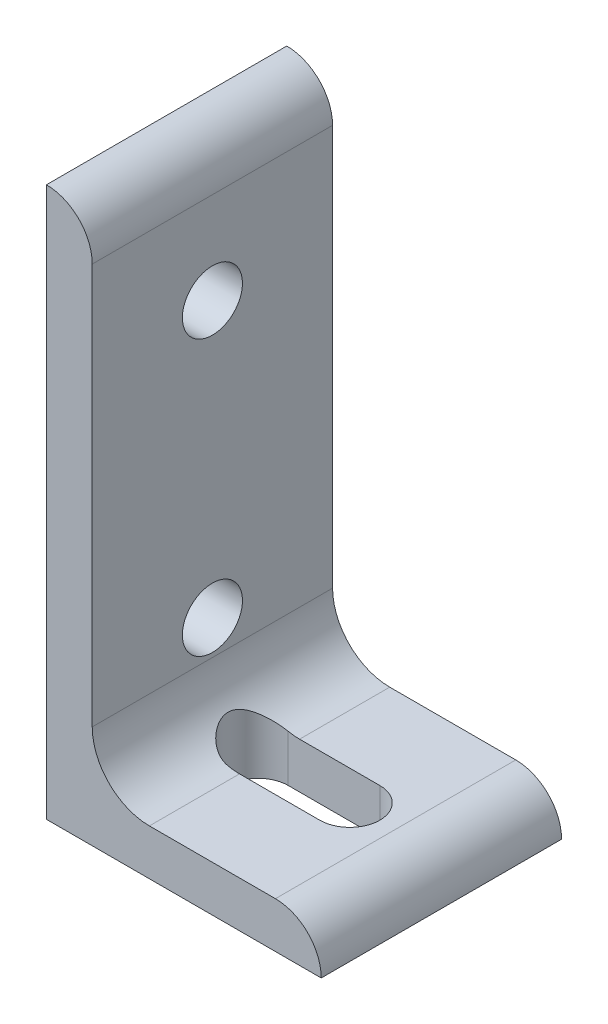
ISO-10303-21;
HEADER;
FILE_DESCRIPTION(('STEP AP214'),'2;1');
FILE_NAME('part.step','',(''),(''),'','','');
FILE_SCHEMA(('AUTOMOTIVE_DESIGN { 1 0 10303 214 1 1 1 1 }'));
ENDSEC;
DATA;
#1=APPLICATION_CONTEXT('core data for automotive mechanical design processes');
#2=APPLICATION_PROTOCOL_DEFINITION('international standard','automotive_design',2000,#1);
#3=PRODUCT_CONTEXT('',#1,'mechanical');
#4=PRODUCT('Part','Part','',(#3));
#5=PRODUCT_RELATED_PRODUCT_CATEGORY('part','',(#4));
#6=PRODUCT_DEFINITION_FORMATION('','',#4);
#7=PRODUCT_DEFINITION_CONTEXT('part definition',#1,'design');
#8=PRODUCT_DEFINITION('design','',#6,#7);
#9=PRODUCT_DEFINITION_SHAPE('','',#8);
#10=(LENGTH_UNIT() NAMED_UNIT(*) SI_UNIT(.MILLI.,.METRE.));
#11=(NAMED_UNIT(*) PLANE_ANGLE_UNIT() SI_UNIT($,.RADIAN.));
#12=(NAMED_UNIT(*) SI_UNIT($,.STERADIAN.) SOLID_ANGLE_UNIT());
#13=UNCERTAINTY_MEASURE_WITH_UNIT(LENGTH_MEASURE(1.E-05),#10,'distance_accuracy_value','');
#14=(GEOMETRIC_REPRESENTATION_CONTEXT(3) GLOBAL_UNCERTAINTY_ASSIGNED_CONTEXT((#13)) GLOBAL_UNIT_ASSIGNED_CONTEXT((#10,
#11,#12)) REPRESENTATION_CONTEXT('',''));
#15=CARTESIAN_POINT('',(0.,0.,0.));
#16=DIRECTION('',(0.,0.,1.));
#17=DIRECTION('',(1.,0.,0.));
#18=AXIS2_PLACEMENT_3D('',#15,#16,#17);
#19=CARTESIAN_POINT('',(38.1,0.,16.6624));
#20=DIRECTION('',(0.,1.,0.));
#21=DIRECTION('',(-1.,0.,0.));
#22=AXIS2_PLACEMENT_3D('',#19,#20,#21);
#23=PLANE('',#22);
#24=DIRECTION('',(-1.,0.,0.));
#25=VECTOR('',#24,1.);
#26=CARTESIAN_POINT('',(25.4,0.,4.1656));
#27=LINE('',#26,#25);
#28=CARTESIAN_POINT('',(25.4,0.,4.1656));
#29=VERTEX_POINT('',#28);
#30=CARTESIAN_POINT('',(12.7,0.,4.1656));
#31=VERTEX_POINT('',#30);
#32=EDGE_CURVE('E249',#29,#31,#27,.T.);
#33=ORIENTED_EDGE('',*,*,#32,.F.);
#34=CARTESIAN_POINT('',(25.4,0.,0.));
#35=DIRECTION('',(0.,-1.,0.));
#36=DIRECTION('',(1.,0.,0.));
#37=AXIS2_PLACEMENT_3D('',#34,#35,#36);
#38=CIRCLE('',#37,4.1656);
#39=CARTESIAN_POINT('',(25.4,0.,-4.1656));
#40=VERTEX_POINT('',#39);
#41=EDGE_CURVE('E54',#40,#29,#38,.T.);
#42=ORIENTED_EDGE('',*,*,#41,.F.);
#43=DIRECTION('',(1.,0.,0.));
#44=VECTOR('',#43,1.);
#45=CARTESIAN_POINT('',(12.7,0.,-4.1656));
#46=LINE('',#45,#44);
#47=CARTESIAN_POINT('',(12.7,0.,-4.1656));
#48=VERTEX_POINT('',#47);
#49=EDGE_CURVE('E239',#48,#40,#46,.T.);
#50=ORIENTED_EDGE('',*,*,#49,.F.);
#51=CARTESIAN_POINT('',(12.7,0.,0.));
#52=DIRECTION('',(0.,-1.,0.));
#53=DIRECTION('',(1.,0.,0.));
#54=AXIS2_PLACEMENT_3D('',#51,#52,#53);
#55=CIRCLE('',#54,4.1656);
#56=EDGE_CURVE('E246',#31,#48,#55,.T.);
#57=ORIENTED_EDGE('',*,*,#56,.F.);
#58=EDGE_LOOP('',(#33,#42,#50,#57));
#59=FACE_BOUND('',#58,.T.);
#60=DIRECTION('',(1.,0.,0.));
#61=VECTOR('',#60,1.);
#62=CARTESIAN_POINT('',(38.1,0.,-16.6624));
#63=LINE('',#62,#61);
#64=CARTESIAN_POINT('',(0.,0.,-16.6624));
#65=VERTEX_POINT('',#64);
#66=CARTESIAN_POINT('',(38.1,0.,-16.6624));
#67=VERTEX_POINT('',#66);
#68=EDGE_CURVE('E188',#65,#67,#63,.T.);
#69=ORIENTED_EDGE('',*,*,#68,.T.);
#70=DIRECTION('',(0.,0.,-1.));
#71=VECTOR('',#70,1.);
#72=CARTESIAN_POINT('',(38.1,0.,16.6624));
#73=LINE('',#72,#71);
#74=CARTESIAN_POINT('',(38.1,0.,16.6624));
#75=VERTEX_POINT('',#74);
#76=EDGE_CURVE('E153',#75,#67,#73,.T.);
#77=ORIENTED_EDGE('',*,*,#76,.F.);
#78=DIRECTION('',(1.,0.,0.));
#79=VECTOR('',#78,1.);
#80=CARTESIAN_POINT('',(38.1,0.,16.6624));
#81=LINE('',#80,#79);
#82=CARTESIAN_POINT('',(0.,0.,16.6624));
#83=VERTEX_POINT('',#82);
#84=EDGE_CURVE('E175',#83,#75,#81,.T.);
#85=ORIENTED_EDGE('',*,*,#84,.F.);
#86=DIRECTION('',(0.,0.,-1.));
#87=VECTOR('',#86,1.);
#88=CARTESIAN_POINT('',(0.,0.,16.6624));
#89=LINE('',#88,#87);
#90=EDGE_CURVE('E194',#83,#65,#89,.T.);
#91=ORIENTED_EDGE('',*,*,#90,.T.);
#92=EDGE_LOOP('',(#69,#77,#85,#91));
#93=FACE_BOUND('',#92,.T.);
#94=ADVANCED_FACE('F39',(#59,#93),#23,.F.);
#95=CARTESIAN_POINT('',(14.2748,6.35,16.6624));
#96=DIRECTION('',(0.,-1.,0.));
#97=DIRECTION('',(1.,0.,0.));
#98=AXIS2_PLACEMENT_3D('',#95,#96,#97);
#99=PLANE('',#98);
#100=DIRECTION('',(0.,0.,-1.));
#101=VECTOR('',#100,1.);
#102=CARTESIAN_POINT('',(14.2748,6.35,16.6624));
#103=LINE('',#102,#101);
#104=CARTESIAN_POINT('',(14.2748,6.35,-4.1656));
#105=VERTEX_POINT('',#104);
#106=CARTESIAN_POINT('',(14.2748,6.35,-16.6624));
#107=VERTEX_POINT('',#106);
#108=EDGE_CURVE('E154',#105,#107,#103,.T.);
#109=ORIENTED_EDGE('',*,*,#108,.F.);
#110=DIRECTION('',(-1.,0.,0.));
#111=VECTOR('',#110,1.);
#112=CARTESIAN_POINT('',(12.7,6.34999999999999,-4.1656));
#113=LINE('',#112,#111);
#114=CARTESIAN_POINT('',(25.4,6.34999999999999,-4.1656));
#115=VERTEX_POINT('',#114);
#116=EDGE_CURVE('E252',#115,#105,#113,.T.);
#117=ORIENTED_EDGE('',*,*,#116,.F.);
#118=CARTESIAN_POINT('',(25.4,6.34999999999999,0.));
#119=DIRECTION('',(0.,-1.,0.));
#120=DIRECTION('',(1.,0.,0.));
#121=AXIS2_PLACEMENT_3D('',#118,#119,#120);
#122=CIRCLE('',#121,4.1656);
#123=CARTESIAN_POINT('',(25.4,6.34999999999999,4.1656));
#124=VERTEX_POINT('',#123);
#125=EDGE_CURVE('E147',#124,#115,#122,.F.);
#126=ORIENTED_EDGE('',*,*,#125,.F.);
#127=DIRECTION('',(1.,0.,0.));
#128=VECTOR('',#127,1.);
#129=CARTESIAN_POINT('',(25.4,6.34999999999999,4.1656));
#130=LINE('',#129,#128);
#131=CARTESIAN_POINT('',(14.2748,6.35,4.1656));
#132=VERTEX_POINT('',#131);
#133=EDGE_CURVE('E130',#132,#124,#130,.T.);
#134=ORIENTED_EDGE('',*,*,#133,.F.);
#135=CARTESIAN_POINT('',(14.2748,6.35,16.6624));
#136=VERTEX_POINT('',#135);
#137=EDGE_CURVE('E143',#136,#132,#103,.T.);
#138=ORIENTED_EDGE('',*,*,#137,.F.);
#139=DIRECTION('',(-1.,0.,0.));
#140=VECTOR('',#139,1.);
#141=CARTESIAN_POINT('',(14.2748,6.35,16.6624));
#142=LINE('',#141,#140);
#143=CARTESIAN_POINT('',(31.75,6.35,16.6624));
#144=VERTEX_POINT('',#143);
#145=EDGE_CURVE('E173',#144,#136,#142,.T.);
#146=ORIENTED_EDGE('',*,*,#145,.F.);
#147=DIRECTION('',(0.,0.,-1.));
#148=VECTOR('',#147,1.);
#149=CARTESIAN_POINT('',(31.75,6.35,16.6624));
#150=LINE('',#149,#148);
#151=CARTESIAN_POINT('',(31.75,6.35,-16.6624));
#152=VERTEX_POINT('',#151);
#153=EDGE_CURVE('E157',#144,#152,#150,.T.);
#154=ORIENTED_EDGE('',*,*,#153,.T.);
#155=DIRECTION('',(-1.,0.,0.));
#156=VECTOR('',#155,1.);
#157=CARTESIAN_POINT('',(14.2748,6.35,-16.6624));
#158=LINE('',#157,#156);
#159=EDGE_CURVE('E190',#152,#107,#158,.T.);
#160=ORIENTED_EDGE('',*,*,#159,.T.);
#161=EDGE_LOOP('',(#109,#117,#126,#134,#138,#146,#154,#160));
#162=FACE_BOUND('',#161,.T.);
#163=ADVANCED_FACE('F141',(#162),#99,.F.);
#164=CARTESIAN_POINT('',(14.2748,14.2748,16.6624));
#165=DIRECTION('',(0.,0.,-1.));
#166=DIRECTION('',(-1.,0.,0.));
#167=AXIS2_PLACEMENT_3D('',#164,#165,#166);
#168=CYLINDRICAL_SURFACE('',#167,7.9248);
#169=CARTESIAN_POINT('',(12.7,6.5080464954783,-4.1656));
#170=CARTESIAN_POINT('',(12.5835580765924,6.5316322027445,-4.16561740535238));
#171=CARTESIAN_POINT('',(12.4676933434238,6.55787464961568,-4.16071876942945));
#172=CARTESIAN_POINT('',(12.2380828578918,6.61528756573018,-4.14150664543221));
#173=CARTESIAN_POINT('',(12.1243353857246,6.64645382103028,-4.12720117520229));
#174=CARTESIAN_POINT('',(11.9004629020729,6.71314980276589,-4.08971516347229));
#175=CARTESIAN_POINT('',(11.7903189589891,6.7486494217396,-4.06659372747525));
#176=CARTESIAN_POINT('',(11.5735592761762,6.82369749415313,-4.0119644114413));
#177=CARTESIAN_POINT('',(11.4669442126567,6.86324671770908,-3.98045493441524));
#178=CARTESIAN_POINT('',(11.1539873654591,6.98693094869243,-3.87432865818805));
#179=CARTESIAN_POINT('',(10.9536021930045,7.07638533753304,-3.78795143881343));
#180=CARTESIAN_POINT('',(10.5719346004298,7.2650354324518,-3.58750983105807));
#181=CARTESIAN_POINT('',(10.3906923921382,7.36425083064593,-3.47338876021333));
#182=CARTESIAN_POINT('',(10.0283860031617,7.58001868893749,-3.2049341898041));
#183=CARTESIAN_POINT('',(9.85008010781651,7.69720346524857,-3.04738262722771));
#184=CARTESIAN_POINT('',(9.52219145004701,7.93007233129113,-2.70373754837415));
#185=CARTESIAN_POINT('',(9.37261112788441,8.04575629274941,-2.5176416096414));
#186=CARTESIAN_POINT('',(9.12625896600255,8.24850232099304,-2.14977251920147));
#187=CARTESIAN_POINT('',(9.02487422812993,8.33719389505684,-1.97199492815169));
#188=CARTESIAN_POINT('',(8.84742149049865,8.49895258090931,-1.59767764113758));
#189=CARTESIAN_POINT('',(8.77130630738445,8.57204872023772,-1.40117380436337));
#190=CARTESIAN_POINT('',(8.66225688177177,8.67959197113029,-1.03748745676759));
#191=CARTESIAN_POINT('',(8.62347457603908,8.71902533273093,-0.873562635560928));
#192=CARTESIAN_POINT('',(8.56591907001295,8.77817530674138,-0.538824344087064));
#193=CARTESIAN_POINT('',(8.54711852353128,8.79791886349327,-0.368020621337599));
#194=CARTESIAN_POINT('',(8.53088867576541,8.81493669321512,-0.023552506824803));
#195=CARTESIAN_POINT('',(8.53354358502665,8.81212242931868,0.150120484464318));
#196=CARTESIAN_POINT('',(8.56019683034547,8.78425424330876,0.49404196625376));
#197=CARTESIAN_POINT('',(8.58421373123496,8.75918097684412,0.664287346324099));
#198=CARTESIAN_POINT('',(8.65780369031964,8.68418406210569,1.02601276038823));
#199=CARTESIAN_POINT('',(8.71112980332612,8.63066424196057,1.21595856593888));
#200=CARTESIAN_POINT('',(8.84129823674257,8.5052584919694,1.5812737039262));
#201=CARTESIAN_POINT('',(8.91818873177568,8.43333498813349,1.75661223077297));
#202=CARTESIAN_POINT('',(9.06363018103847,8.30384494130255,2.0359272444735));
#203=CARTESIAN_POINT('',(9.12656845322995,8.24936632169106,2.14436787754785));
#204=CARTESIAN_POINT('',(9.26101430957051,8.13704224540913,2.35395380195965));
#205=CARTESIAN_POINT('',(9.33252175927477,8.07919684156867,2.45509920771459));
#206=CARTESIAN_POINT('',(9.4837155209309,7.96154748114299,2.65009049694284));
#207=CARTESIAN_POINT('',(9.56341244113339,7.90174105435643,2.74392662870047));
#208=CARTESIAN_POINT('',(9.73054656283487,7.78151020507392,2.92397922756217));
#209=CARTESIAN_POINT('',(9.8179830625586,7.72108583904725,3.0101963840921));
#210=CARTESIAN_POINT('',(10.0018115278443,7.59974547611754,3.17609532271024));
#211=CARTESIAN_POINT('',(10.0983271819743,7.53883775067407,3.25564621844663));
#212=CARTESIAN_POINT('',(10.2987564408494,7.4186212524069,3.4061644336177));
#213=CARTESIAN_POINT('',(10.4026693181952,7.35931232315556,3.47713259518089));
#214=CARTESIAN_POINT('',(10.6172568575748,7.24346608950344,3.60974590493582));
#215=CARTESIAN_POINT('',(10.7279114076557,7.18692136875626,3.67141704343744));
#216=CARTESIAN_POINT('',(10.9558134721983,7.07738622979663,3.78500251768188));
#217=CARTESIAN_POINT('',(11.0730609443779,7.02439578879452,3.8369169159877));
#218=CARTESIAN_POINT('',(11.3093524254135,6.92466825089226,3.92858917841972));
#219=CARTESIAN_POINT('',(11.4281909862074,6.87777747044407,3.96870802231849));
#220=CARTESIAN_POINT('',(11.6706923096469,6.78896300700549,4.03839853103678));
#221=CARTESIAN_POINT('',(11.7943535508775,6.74703777411184,4.06797349275737));
#222=CARTESIAN_POINT('',(12.0467219375613,6.66850733292112,4.11607493407712));
#223=CARTESIAN_POINT('',(12.1754640074441,6.63195239223434,4.13450150587616));
#224=CARTESIAN_POINT('',(12.4358810439194,6.56512440811821,4.15928635187595));
#225=CARTESIAN_POINT('',(12.567559607526,6.5348595974061,4.16562889765032));
#226=CARTESIAN_POINT('',(12.7,6.5080464954783,4.1656));
#227=B_SPLINE_CURVE_WITH_KNOTS('',3,(#169,#170,#171,#172,#173,#174,#175,#176,#177,#178,#179,
#180,#181,#182,#183,#184,#185,#186,#187,#188,#189,#190,#191,#192,#193,#194,#195,#196,#197,#198,
#199,#200,#201,#202,#203,#204,#205,#206,#207,#208,#209,#210,#211,#212,#213,#214,#215,#216,#217,
#218,#219,#220,#221,#222,#223,#224,#225,#226),.UNSPECIFIED.,.F.,.F.,(4,2,2,2,2,2,2,2,2,2,2,2,2,
2,2,2,2,2,2,2,2,2,2,2,2,2,2,2,4),(0.,0.356230564600408,0.712157891644706,1.0657397548369,
1.41938898426377,2.12376165412194,2.82958567821204,3.62213731146315,4.41475624289145,
5.08166429224455,5.74731999275771,6.26425629437071,6.7804842243145,7.29873927905102,
7.81744516857058,8.42741656536718,9.0386433912707,9.44829000204645,9.85793018657467,
10.2681078534863,10.6782483661516,11.0951378285751,11.5119863530162,11.9276470386122,
12.3433050587821,12.7444590989697,13.145487594549,13.5500586889426,13.955156009535),.UNSPECIFIED.);
#228=CARTESIAN_POINT('',(12.7,6.5080464954783,-4.1656));
#229=VERTEX_POINT('',#228);
#230=CARTESIAN_POINT('',(12.7,6.5080464954783,4.1656));
#231=VERTEX_POINT('',#230);
#232=EDGE_CURVE('E62',#229,#231,#227,.T.);
#233=ORIENTED_EDGE('',*,*,#232,.F.);
#234=CARTESIAN_POINT('',(14.2748,14.2748,-4.1656));
#235=DIRECTION('',(0.,0.,-1.));
#236=DIRECTION('',(-1.,0.,0.));
#237=AXIS2_PLACEMENT_3D('',#234,#235,#236);
#238=CIRCLE('',#237,7.9248);
#239=EDGE_CURVE('E255',#105,#229,#238,.T.);
#240=ORIENTED_EDGE('',*,*,#239,.F.);
#241=ORIENTED_EDGE('',*,*,#108,.T.);
#242=CARTESIAN_POINT('',(14.2748,14.2748,-16.6624));
#243=DIRECTION('',(0.,0.,-1.));
#244=DIRECTION('',(1.,0.,0.));
#245=AXIS2_PLACEMENT_3D('',#242,#243,#244);
#246=CIRCLE('',#245,7.9248);
#247=CARTESIAN_POINT('',(6.34999999999999,14.2748,-16.6624));
#248=VERTEX_POINT('',#247);
#249=EDGE_CURVE('E197',#107,#248,#246,.T.);
#250=ORIENTED_EDGE('',*,*,#249,.T.);
#251=DIRECTION('',(0.,0.,-1.));
#252=VECTOR('',#251,1.);
#253=CARTESIAN_POINT('',(6.34999999999999,14.2748,16.6624));
#254=LINE('',#253,#252);
#255=CARTESIAN_POINT('',(6.34999999999999,14.2748,16.6624));
#256=VERTEX_POINT('',#255);
#257=EDGE_CURVE('E159',#256,#248,#254,.T.);
#258=ORIENTED_EDGE('',*,*,#257,.F.);
#259=CARTESIAN_POINT('',(14.2748,14.2748,16.6624));
#260=DIRECTION('',(0.,0.,-1.));
#261=DIRECTION('',(1.,0.,0.));
#262=AXIS2_PLACEMENT_3D('',#259,#260,#261);
#263=CIRCLE('',#262,7.9248);
#264=EDGE_CURVE('E152',#136,#256,#263,.T.);
#265=ORIENTED_EDGE('',*,*,#264,.F.);
#266=ORIENTED_EDGE('',*,*,#137,.T.);
#267=CARTESIAN_POINT('',(14.2748,14.2748,4.1656));
#268=DIRECTION('',(0.,0.,1.));
#269=DIRECTION('',(1.,0.,0.));
#270=AXIS2_PLACEMENT_3D('',#267,#268,#269);
#271=CIRCLE('',#270,7.9248);
#272=EDGE_CURVE('E127',#231,#132,#271,.T.);
#273=ORIENTED_EDGE('',*,*,#272,.F.);
#274=EDGE_LOOP('',(#233,#240,#241,#250,#258,#265,#266,#273));
#275=FACE_BOUND('',#274,.T.);
#276=ADVANCED_FACE('F150',(#275),#168,.F.);
#277=CARTESIAN_POINT('',(6.34999999999999,76.2,16.6624));
#278=DIRECTION('',(-1.,0.,0.));
#279=DIRECTION('',(0.,-1.,0.));
#280=AXIS2_PLACEMENT_3D('',#277,#278,#279);
#281=PLANE('',#280);
#282=CARTESIAN_POINT('',(6.34999999999999,19.05,0.));
#283=DIRECTION('',(-1.,0.,0.));
#284=DIRECTION('',(0.,-1.,0.));
#285=AXIS2_PLACEMENT_3D('',#282,#283,#284);
#286=CIRCLE('',#285,4.1656);
#287=CARTESIAN_POINT('',(6.34999999999999,14.8844,0.));
#288=VERTEX_POINT('',#287);
#289=EDGE_CURVE('E232',#288,#288,#286,.F.);
#290=ORIENTED_EDGE('',*,*,#289,.F.);
#291=EDGE_LOOP('',(#290));
#292=FACE_BOUND('',#291,.T.);
#293=CARTESIAN_POINT('',(6.34999999999999,57.15,0.));
#294=DIRECTION('',(-1.,0.,0.));
#295=DIRECTION('',(0.,-1.,0.));
#296=AXIS2_PLACEMENT_3D('',#293,#294,#295);
#297=CIRCLE('',#296,4.1656);
#298=CARTESIAN_POINT('',(6.34999999999999,52.9844,0.));
#299=VERTEX_POINT('',#298);
#300=EDGE_CURVE('E195',#299,#299,#297,.F.);
#301=ORIENTED_EDGE('',*,*,#300,.F.);
#302=EDGE_LOOP('',(#301));
#303=FACE_BOUND('',#302,.T.);
#304=DIRECTION('',(0.,1.,0.));
#305=VECTOR('',#304,1.);
#306=CARTESIAN_POINT('',(6.34999999999999,76.2,-16.6624));
#307=LINE('',#306,#305);
#308=CARTESIAN_POINT('',(6.34999999999999,69.85,-16.6624));
#309=VERTEX_POINT('',#308);
#310=EDGE_CURVE('E207',#248,#309,#307,.T.);
#311=ORIENTED_EDGE('',*,*,#310,.T.);
#312=DIRECTION('',(0.,0.,-1.));
#313=VECTOR('',#312,1.);
#314=CARTESIAN_POINT('',(6.34999999999999,69.85,16.6624));
#315=LINE('',#314,#313);
#316=CARTESIAN_POINT('',(6.34999999999999,69.85,16.6624));
#317=VERTEX_POINT('',#316);
#318=EDGE_CURVE('E11',#309,#317,#315,.F.);
#319=ORIENTED_EDGE('',*,*,#318,.T.);
#320=DIRECTION('',(0.,1.,0.));
#321=VECTOR('',#320,1.);
#322=CARTESIAN_POINT('',(6.34999999999999,76.2,16.6624));
#323=LINE('',#322,#321);
#324=EDGE_CURVE('E224',#256,#317,#323,.T.);
#325=ORIENTED_EDGE('',*,*,#324,.F.);
#326=ORIENTED_EDGE('',*,*,#257,.T.);
#327=EDGE_LOOP('',(#311,#319,#325,#326));
#328=FACE_BOUND('',#327,.T.);
#329=ADVANCED_FACE('F221',(#292,#303,#328),#281,.F.);
#330=CARTESIAN_POINT('',(0.,0.,16.6624));
#331=DIRECTION('',(1.,0.,0.));
#332=DIRECTION('',(0.,1.,0.));
#333=AXIS2_PLACEMENT_3D('',#330,#331,#332);
#334=PLANE('',#333);
#335=CARTESIAN_POINT('',(0.,19.05,0.));
#336=DIRECTION('',(-1.,0.,0.));
#337=DIRECTION('',(0.,-1.,0.));
#338=AXIS2_PLACEMENT_3D('',#335,#336,#337);
#339=CIRCLE('',#338,4.1656);
#340=CARTESIAN_POINT('',(0.,14.8844,0.));
#341=VERTEX_POINT('',#340);
#342=EDGE_CURVE('E148',#341,#341,#339,.T.);
#343=ORIENTED_EDGE('',*,*,#342,.F.);
#344=EDGE_LOOP('',(#343));
#345=FACE_BOUND('',#344,.T.);
#346=CARTESIAN_POINT('',(0.,57.15,0.));
#347=DIRECTION('',(-1.,0.,0.));
#348=DIRECTION('',(0.,-1.,0.));
#349=AXIS2_PLACEMENT_3D('',#346,#347,#348);
#350=CIRCLE('',#349,4.1656);
#351=CARTESIAN_POINT('',(0.,52.9844,0.));
#352=VERTEX_POINT('',#351);
#353=EDGE_CURVE('E200',#352,#352,#350,.T.);
#354=ORIENTED_EDGE('',*,*,#353,.F.);
#355=EDGE_LOOP('',(#354));
#356=FACE_BOUND('',#355,.T.);
#357=DIRECTION('',(0.,-1.,0.));
#358=VECTOR('',#357,1.);
#359=CARTESIAN_POINT('',(0.,0.,-16.6624));
#360=LINE('',#359,#358);
#361=CARTESIAN_POINT('',(0.,76.2,-16.6624));
#362=VERTEX_POINT('',#361);
#363=EDGE_CURVE('E210',#362,#65,#360,.T.);
#364=ORIENTED_EDGE('',*,*,#363,.T.);
#365=ORIENTED_EDGE('',*,*,#90,.F.);
#366=DIRECTION('',(0.,-1.,0.));
#367=VECTOR('',#366,1.);
#368=CARTESIAN_POINT('',(0.,0.,16.6624));
#369=LINE('',#368,#367);
#370=CARTESIAN_POINT('',(0.,76.2,16.6624));
#371=VERTEX_POINT('',#370);
#372=EDGE_CURVE('E203',#371,#83,#369,.T.);
#373=ORIENTED_EDGE('',*,*,#372,.F.);
#374=DIRECTION('',(0.,0.,-1.));
#375=VECTOR('',#374,1.);
#376=CARTESIAN_POINT('',(0.,76.2,16.6624));
#377=LINE('',#376,#375);
#378=EDGE_CURVE('E212',#371,#362,#377,.T.);
#379=ORIENTED_EDGE('',*,*,#378,.T.);
#380=EDGE_LOOP('',(#364,#365,#373,#379));
#381=FACE_BOUND('',#380,.T.);
#382=ADVANCED_FACE('F299',(#345,#356,#381),#334,.F.);
#383=CARTESIAN_POINT('',(14.2748,14.2748,16.6624));
#384=DIRECTION('',(0.,0.,1.));
#385=DIRECTION('',(1.,0.,0.));
#386=AXIS2_PLACEMENT_3D('',#383,#384,#385);
#387=PLANE('',#386);
#388=ORIENTED_EDGE('',*,*,#84,.T.);
#389=CARTESIAN_POINT('',(31.75,0.,16.6624));
#390=DIRECTION('',(0.,0.,1.));
#391=DIRECTION('',(1.,0.,0.));
#392=AXIS2_PLACEMENT_3D('',#389,#390,#391);
#393=CIRCLE('',#392,6.35);
#394=EDGE_CURVE('E47',#75,#144,#393,.T.);
#395=ORIENTED_EDGE('',*,*,#394,.T.);
#396=ORIENTED_EDGE('',*,*,#145,.T.);
#397=ORIENTED_EDGE('',*,*,#264,.T.);
#398=ORIENTED_EDGE('',*,*,#324,.T.);
#399=CARTESIAN_POINT('',(0.,69.85,16.6624));
#400=DIRECTION('',(0.,0.,1.));
#401=DIRECTION('',(1.,0.,0.));
#402=AXIS2_PLACEMENT_3D('',#399,#400,#401);
#403=CIRCLE('',#402,6.35);
#404=EDGE_CURVE('E169',#317,#371,#403,.T.);
#405=ORIENTED_EDGE('',*,*,#404,.T.);
#406=ORIENTED_EDGE('',*,*,#372,.T.);
#407=EDGE_LOOP('',(#388,#395,#396,#397,#398,#405,#406));
#408=FACE_BOUND('',#407,.T.);
#409=ADVANCED_FACE('F172',(#408),#387,.T.);
#410=CARTESIAN_POINT('',(14.2748,14.2748,-16.6624));
#411=DIRECTION('',(0.,0.,1.));
#412=DIRECTION('',(1.,0.,0.));
#413=AXIS2_PLACEMENT_3D('',#410,#411,#412);
#414=PLANE('',#413);
#415=ORIENTED_EDGE('',*,*,#159,.F.);
#416=CARTESIAN_POINT('',(31.75,0.,-16.6624));
#417=DIRECTION('',(0.,0.,1.));
#418=DIRECTION('',(1.,0.,0.));
#419=AXIS2_PLACEMENT_3D('',#416,#417,#418);
#420=CIRCLE('',#419,6.35);
#421=EDGE_CURVE('E167',#152,#67,#420,.F.);
#422=ORIENTED_EDGE('',*,*,#421,.T.);
#423=ORIENTED_EDGE('',*,*,#68,.F.);
#424=ORIENTED_EDGE('',*,*,#363,.F.);
#425=CARTESIAN_POINT('',(0.,69.85,-16.6624));
#426=DIRECTION('',(0.,0.,1.));
#427=DIRECTION('',(1.,0.,0.));
#428=AXIS2_PLACEMENT_3D('',#425,#426,#427);
#429=CIRCLE('',#428,6.35);
#430=EDGE_CURVE('E165',#362,#309,#429,.F.);
#431=ORIENTED_EDGE('',*,*,#430,.T.);
#432=ORIENTED_EDGE('',*,*,#310,.F.);
#433=ORIENTED_EDGE('',*,*,#249,.F.);
#434=EDGE_LOOP('',(#415,#422,#423,#424,#431,#432,#433));
#435=FACE_BOUND('',#434,.T.);
#436=ADVANCED_FACE('F186',(#435),#414,.F.);
#437=CARTESIAN_POINT('',(31.75,0.,16.6624));
#438=DIRECTION('',(0.,0.,-1.));
#439=DIRECTION('',(-1.,0.,0.));
#440=AXIS2_PLACEMENT_3D('',#437,#438,#439);
#441=CYLINDRICAL_SURFACE('',#440,6.35);
#442=ORIENTED_EDGE('',*,*,#394,.F.);
#443=ORIENTED_EDGE('',*,*,#76,.T.);
#444=ORIENTED_EDGE('',*,*,#421,.F.);
#445=ORIENTED_EDGE('',*,*,#153,.F.);
#446=EDGE_LOOP('',(#442,#443,#444,#445));
#447=FACE_BOUND('',#446,.T.);
#448=ADVANCED_FACE('F182',(#447),#441,.T.);
#449=CARTESIAN_POINT('',(0.,69.85,16.6624));
#450=DIRECTION('',(0.,0.,-1.));
#451=DIRECTION('',(-1.,0.,0.));
#452=AXIS2_PLACEMENT_3D('',#449,#450,#451);
#453=CYLINDRICAL_SURFACE('',#452,6.35);
#454=ORIENTED_EDGE('',*,*,#404,.F.);
#455=ORIENTED_EDGE('',*,*,#318,.F.);
#456=ORIENTED_EDGE('',*,*,#430,.F.);
#457=ORIENTED_EDGE('',*,*,#378,.F.);
#458=EDGE_LOOP('',(#454,#455,#456,#457));
#459=FACE_BOUND('',#458,.T.);
#460=ADVANCED_FACE('F41',(#459),#453,.T.);
#461=CARTESIAN_POINT('',(38.101,57.15,0.));
#462=DIRECTION('',(-1.,0.,0.));
#463=DIRECTION('',(0.,-1.,0.));
#464=AXIS2_PLACEMENT_3D('',#461,#462,#463);
#465=CYLINDRICAL_SURFACE('',#464,4.1656);
#466=CARTESIAN_POINT('',(0.,52.9844,0.));
#467=CARTESIAN_POINT('',(0.0661458333333272,52.9844,0.));
#468=CARTESIAN_POINT('',(0.132291666666661,52.9844,0.));
#469=CARTESIAN_POINT('',(0.264583333333327,52.9844,0.));
#470=CARTESIAN_POINT('',(0.330729166666659,52.9844,0.));
#471=CARTESIAN_POINT('',(0.463020833333325,52.9844,0.));
#472=CARTESIAN_POINT('',(0.529166666666659,52.9844,0.));
#473=CARTESIAN_POINT('',(0.661458333333325,52.9844,0.));
#474=CARTESIAN_POINT('',(0.727604166666657,52.9844,0.));
#475=CARTESIAN_POINT('',(0.859895833333323,52.9844,0.));
#476=CARTESIAN_POINT('',(0.926041666666657,52.9844,0.));
#477=CARTESIAN_POINT('',(1.05833333333333,52.9844,0.));
#478=CARTESIAN_POINT('',(1.12447916666666,52.9844,0.));
#479=CARTESIAN_POINT('',(1.25677083333333,52.9844,0.));
#480=CARTESIAN_POINT('',(1.32291666666666,52.9844,0.));
#481=CARTESIAN_POINT('',(1.45520833333332,52.9844,0.));
#482=CARTESIAN_POINT('',(1.52135416666666,52.9844,0.));
#483=CARTESIAN_POINT('',(1.65364583333333,52.9844,0.));
#484=CARTESIAN_POINT('',(1.71979166666666,52.9844,0.));
#485=CARTESIAN_POINT('',(1.85208333333333,52.9844,0.));
#486=CARTESIAN_POINT('',(1.91822916666666,52.9844,0.));
#487=CARTESIAN_POINT('',(2.05052083333332,52.9844,0.));
#488=CARTESIAN_POINT('',(2.11666666666666,52.9844,0.));
#489=CARTESIAN_POINT('',(2.24895833333333,52.9844,0.));
#490=CARTESIAN_POINT('',(2.31510416666666,52.9844,0.));
#491=CARTESIAN_POINT('',(2.44739583333333,52.9844,0.));
#492=CARTESIAN_POINT('',(2.51354166666666,52.9844,0.));
#493=CARTESIAN_POINT('',(2.64583333333332,52.9844,0.));
#494=CARTESIAN_POINT('',(2.71197916666666,52.9844,0.));
#495=CARTESIAN_POINT('',(2.84427083333332,52.9844,0.));
#496=CARTESIAN_POINT('',(2.91041666666666,52.9844,0.));
#497=CARTESIAN_POINT('',(3.04270833333332,52.9844,0.));
#498=CARTESIAN_POINT('',(3.10885416666666,52.9844,0.));
#499=CARTESIAN_POINT('',(3.24114583333332,52.9844,0.));
#500=CARTESIAN_POINT('',(3.30729166666666,52.9844,0.));
#501=CARTESIAN_POINT('',(3.43958333333332,52.9844,0.));
#502=CARTESIAN_POINT('',(3.50572916666666,52.9844,0.));
#503=CARTESIAN_POINT('',(3.63802083333332,52.9844,0.));
#504=CARTESIAN_POINT('',(3.70416666666666,52.9844,0.));
#505=CARTESIAN_POINT('',(3.83645833333332,52.9844,0.));
#506=CARTESIAN_POINT('',(3.90260416666665,52.9844,0.));
#507=CARTESIAN_POINT('',(4.03489583333332,52.9844,0.));
#508=CARTESIAN_POINT('',(4.10104166666665,52.9844,0.));
#509=CARTESIAN_POINT('',(4.23333333333332,52.9844,0.));
#510=CARTESIAN_POINT('',(4.29947916666666,52.9844,0.));
#511=CARTESIAN_POINT('',(4.43177083333332,52.9844,0.));
#512=CARTESIAN_POINT('',(4.49791666666665,52.9844,0.));
#513=CARTESIAN_POINT('',(4.63020833333332,52.9844,0.));
#514=CARTESIAN_POINT('',(4.69635416666666,52.9844,0.));
#515=CARTESIAN_POINT('',(4.82864583333332,52.9844,0.));
#516=CARTESIAN_POINT('',(4.89479166666666,52.9844,0.));
#517=CARTESIAN_POINT('',(5.02708333333332,52.9844,0.));
#518=CARTESIAN_POINT('',(5.09322916666665,52.9844,0.));
#519=CARTESIAN_POINT('',(5.22552083333332,52.9844,0.));
#520=CARTESIAN_POINT('',(5.29166666666666,52.9844,0.));
#521=CARTESIAN_POINT('',(5.42395833333332,52.9844,0.));
#522=CARTESIAN_POINT('',(5.49010416666666,52.9844,0.));
#523=CARTESIAN_POINT('',(5.62239583333332,52.9844,0.));
#524=CARTESIAN_POINT('',(5.68854166666666,52.9844,0.));
#525=CARTESIAN_POINT('',(5.82083333333332,52.9844,0.));
#526=CARTESIAN_POINT('',(5.88697916666666,52.9844,0.));
#527=CARTESIAN_POINT('',(6.01927083333332,52.9844,0.));
#528=CARTESIAN_POINT('',(6.08541666666665,52.9844,0.));
#529=CARTESIAN_POINT('',(6.21770833333332,52.9844,0.));
#530=CARTESIAN_POINT('',(6.28385416666665,52.9844,0.));
#531=CARTESIAN_POINT('',(6.34999999999999,52.9844,0.));
#532=B_SPLINE_CURVE_WITH_KNOTS('',3,(#466,#467,#468,#469,#470,#471,#472,#473,#474,#475,#476,
#477,#478,#479,#480,#481,#482,#483,#484,#485,#486,#487,#488,#489,#490,#491,#492,#493,#494,#495,
#496,#497,#498,#499,#500,#501,#502,#503,#504,#505,#506,#507,#508,#509,#510,#511,#512,#513,#514,
#515,#516,#517,#518,#519,#520,#521,#522,#523,#524,#525,#526,#527,#528,#529,#530,#531),
.UNSPECIFIED.,.F.,.F.,(4,2,2,2,2,2,2,2,2,2,2,2,2,2,2,2,2,2,2,2,2,2,2,2,2,2,2,2,2,2,2,2,4),(0.,
0.198437500000002,0.396874999999998,0.5953125,0.793749999999996,0.992187499999998,1.190625,
1.3890625,1.5875,1.7859375,1.984375,2.1828125,2.38125,2.5796875,2.778125,2.97656249999999,3.175,
3.3734375,3.571875,3.7703125,3.96874999999999,4.1671875,4.365625,4.56406249999999,4.7625,
4.9609375,5.15937499999999,5.3578125,5.55625,5.75468749999999,5.953125,6.15156249999999,
6.34999999999999),.UNSPECIFIED.);
#533=EDGE_CURVE('BSEAM294',#352,#299,#532,.T.);
#534=ORIENTED_EDGE('',*,*,#353,.T.);
#535=ORIENTED_EDGE('',*,*,#300,.T.);
#536=ORIENTED_EDGE('',*,*,#533,.T.);
#537=ORIENTED_EDGE('',*,*,#533,.F.);
#538=EDGE_LOOP('',(#534,#536,#535,#537));
#539=FACE_BOUND('',#538,.T.);
#540=ADVANCED_FACE('F294',(#539),#465,.F.);
#541=CARTESIAN_POINT('',(38.101,19.05,0.));
#542=DIRECTION('',(-1.,0.,0.));
#543=DIRECTION('',(0.,-1.,0.));
#544=AXIS2_PLACEMENT_3D('',#541,#542,#543);
#545=CYLINDRICAL_SURFACE('',#544,4.1656);
#546=CARTESIAN_POINT('',(0.,14.8844,0.));
#547=CARTESIAN_POINT('',(0.0661458333333341,14.8844,0.));
#548=CARTESIAN_POINT('',(0.132291666666668,14.8844,0.));
#549=CARTESIAN_POINT('',(0.264583333333334,14.8844,0.));
#550=CARTESIAN_POINT('',(0.330729166666666,14.8844,0.));
#551=CARTESIAN_POINT('',(0.463020833333332,14.8844,0.));
#552=CARTESIAN_POINT('',(0.529166666666666,14.8844,0.));
#553=CARTESIAN_POINT('',(0.661458333333332,14.8844,0.));
#554=CARTESIAN_POINT('',(0.727604166666664,14.8844,0.));
#555=CARTESIAN_POINT('',(0.85989583333333,14.8844,0.));
#556=CARTESIAN_POINT('',(0.926041666666664,14.8844,0.));
#557=CARTESIAN_POINT('',(1.05833333333333,14.8844,0.));
#558=CARTESIAN_POINT('',(1.12447916666667,14.8844,0.));
#559=CARTESIAN_POINT('',(1.25677083333333,14.8844,0.));
#560=CARTESIAN_POINT('',(1.32291666666666,14.8844,0.));
#561=CARTESIAN_POINT('',(1.45520833333333,14.8844,0.));
#562=CARTESIAN_POINT('',(1.52135416666666,14.8844,0.));
#563=CARTESIAN_POINT('',(1.65364583333333,14.8844,0.));
#564=CARTESIAN_POINT('',(1.71979166666667,14.8844,0.));
#565=CARTESIAN_POINT('',(1.85208333333333,14.8844,0.));
#566=CARTESIAN_POINT('',(1.91822916666666,14.8844,0.));
#567=CARTESIAN_POINT('',(2.05052083333333,14.8844,0.));
#568=CARTESIAN_POINT('',(2.11666666666666,14.8844,0.));
#569=CARTESIAN_POINT('',(2.24895833333333,14.8844,0.));
#570=CARTESIAN_POINT('',(2.31510416666667,14.8844,0.));
#571=CARTESIAN_POINT('',(2.44739583333333,14.8844,0.));
#572=CARTESIAN_POINT('',(2.51354166666667,14.8844,0.));
#573=CARTESIAN_POINT('',(2.64583333333333,14.8844,0.));
#574=CARTESIAN_POINT('',(2.71197916666667,14.8844,0.));
#575=CARTESIAN_POINT('',(2.84427083333333,14.8844,0.));
#576=CARTESIAN_POINT('',(2.91041666666666,14.8844,0.));
#577=CARTESIAN_POINT('',(3.04270833333333,14.8844,0.));
#578=CARTESIAN_POINT('',(3.10885416666666,14.8844,0.));
#579=CARTESIAN_POINT('',(3.24114583333333,14.8844,0.));
#580=CARTESIAN_POINT('',(3.30729166666667,14.8844,0.));
#581=CARTESIAN_POINT('',(3.43958333333333,14.8844,0.));
#582=CARTESIAN_POINT('',(3.50572916666666,14.8844,0.));
#583=CARTESIAN_POINT('',(3.63802083333333,14.8844,0.));
#584=CARTESIAN_POINT('',(3.70416666666666,14.8844,0.));
#585=CARTESIAN_POINT('',(3.83645833333333,14.8844,0.));
#586=CARTESIAN_POINT('',(3.90260416666666,14.8844,0.));
#587=CARTESIAN_POINT('',(4.03489583333333,14.8844,0.));
#588=CARTESIAN_POINT('',(4.10104166666666,14.8844,0.));
#589=CARTESIAN_POINT('',(4.23333333333333,14.8844,0.));
#590=CARTESIAN_POINT('',(4.29947916666666,14.8844,0.));
#591=CARTESIAN_POINT('',(4.43177083333333,14.8844,0.));
#592=CARTESIAN_POINT('',(4.49791666666666,14.8844,0.));
#593=CARTESIAN_POINT('',(4.63020833333333,14.8844,0.));
#594=CARTESIAN_POINT('',(4.69635416666666,14.8844,0.));
#595=CARTESIAN_POINT('',(4.82864583333333,14.8844,0.));
#596=CARTESIAN_POINT('',(4.89479166666666,14.8844,0.));
#597=CARTESIAN_POINT('',(5.02708333333333,14.8844,0.));
#598=CARTESIAN_POINT('',(5.09322916666666,14.8844,0.));
#599=CARTESIAN_POINT('',(5.22552083333333,14.8844,0.));
#600=CARTESIAN_POINT('',(5.29166666666666,14.8844,0.));
#601=CARTESIAN_POINT('',(5.42395833333333,14.8844,0.));
#602=CARTESIAN_POINT('',(5.49010416666667,14.8844,0.));
#603=CARTESIAN_POINT('',(5.62239583333333,14.8844,0.));
#604=CARTESIAN_POINT('',(5.68854166666666,14.8844,0.));
#605=CARTESIAN_POINT('',(5.82083333333333,14.8844,0.));
#606=CARTESIAN_POINT('',(5.88697916666666,14.8844,0.));
#607=CARTESIAN_POINT('',(6.01927083333333,14.8844,0.));
#608=CARTESIAN_POINT('',(6.08541666666666,14.8844,0.));
#609=CARTESIAN_POINT('',(6.21770833333333,14.8844,0.));
#610=CARTESIAN_POINT('',(6.28385416666666,14.8844,0.));
#611=CARTESIAN_POINT('',(6.34999999999999,14.8844,0.));
#612=B_SPLINE_CURVE_WITH_KNOTS('',3,(#546,#547,#548,#549,#550,#551,#552,#553,#554,#555,#556,
#557,#558,#559,#560,#561,#562,#563,#564,#565,#566,#567,#568,#569,#570,#571,#572,#573,#574,#575,
#576,#577,#578,#579,#580,#581,#582,#583,#584,#585,#586,#587,#588,#589,#590,#591,#592,#593,#594,
#595,#596,#597,#598,#599,#600,#601,#602,#603,#604,#605,#606,#607,#608,#609,#610,#611),
.UNSPECIFIED.,.F.,.F.,(4,2,2,2,2,2,2,2,2,2,2,2,2,2,2,2,2,2,2,2,2,2,2,2,2,2,2,2,2,2,2,2,4),(0.,
0.198437500000002,0.396874999999998,0.5953125,0.793749999999996,0.992187499999998,1.190625,
1.3890625,1.5875,1.7859375,1.984375,2.1828125,2.38125,2.5796875,2.778125,2.97656249999999,3.175,
3.3734375,3.571875,3.7703125,3.96874999999999,4.1671875,4.365625,4.56406249999999,4.7625,
4.9609375,5.15937499999999,5.3578125,5.55625,5.75468749999999,5.953125,6.15156249999999,
6.34999999999999),.UNSPECIFIED.);
#613=EDGE_CURVE('BSEAM277',#341,#288,#612,.T.);
#614=ORIENTED_EDGE('',*,*,#342,.T.);
#615=ORIENTED_EDGE('',*,*,#289,.T.);
#616=ORIENTED_EDGE('',*,*,#613,.T.);
#617=ORIENTED_EDGE('',*,*,#613,.F.);
#618=EDGE_LOOP('',(#614,#616,#615,#617));
#619=FACE_BOUND('',#618,.T.);
#620=ADVANCED_FACE('F277',(#619),#545,.F.);
#621=CARTESIAN_POINT('',(25.4,76.201,0.));
#622=DIRECTION('',(0.,-1.,0.));
#623=DIRECTION('',(1.,0.,0.));
#624=AXIS2_PLACEMENT_3D('',#621,#622,#623);
#625=CYLINDRICAL_SURFACE('',#624,4.1656);
#626=ORIENTED_EDGE('',*,*,#125,.T.);
#627=DIRECTION('',(0.,-1.,0.));
#628=VECTOR('',#627,1.);
#629=CARTESIAN_POINT('',(25.4,76.201,-4.1656));
#630=LINE('',#629,#628);
#631=EDGE_CURVE('E136',#115,#40,#630,.T.);
#632=ORIENTED_EDGE('',*,*,#631,.T.);
#633=ORIENTED_EDGE('',*,*,#41,.T.);
#634=DIRECTION('',(0.,-1.,0.));
#635=VECTOR('',#634,1.);
#636=CARTESIAN_POINT('',(25.4,76.201,4.1656));
#637=LINE('',#636,#635);
#638=EDGE_CURVE('E237',#124,#29,#637,.T.);
#639=ORIENTED_EDGE('',*,*,#638,.F.);
#640=EDGE_LOOP('',(#626,#632,#633,#639));
#641=FACE_BOUND('',#640,.T.);
#642=ADVANCED_FACE('F271',(#641),#625,.F.);
#643=CARTESIAN_POINT('',(12.7,76.201,-4.1656));
#644=DIRECTION('',(0.,0.,-1.));
#645=DIRECTION('',(-1.,0.,0.));
#646=AXIS2_PLACEMENT_3D('',#643,#644,#645);
#647=PLANE('',#646);
#648=ORIENTED_EDGE('',*,*,#116,.T.);
#649=ORIENTED_EDGE('',*,*,#239,.T.);
#650=DIRECTION('',(0.,-1.,0.));
#651=VECTOR('',#650,1.);
#652=CARTESIAN_POINT('',(12.7,76.201,-4.1656));
#653=LINE('',#652,#651);
#654=EDGE_CURVE('E241',#229,#48,#653,.T.);
#655=ORIENTED_EDGE('',*,*,#654,.T.);
#656=ORIENTED_EDGE('',*,*,#49,.T.);
#657=ORIENTED_EDGE('',*,*,#631,.F.);
#658=EDGE_LOOP('',(#648,#649,#655,#656,#657));
#659=FACE_BOUND('',#658,.T.);
#660=ADVANCED_FACE('F269',(#659),#647,.F.);
#661=CARTESIAN_POINT('',(12.7,76.201,0.));
#662=DIRECTION('',(0.,-1.,0.));
#663=DIRECTION('',(1.,0.,0.));
#664=AXIS2_PLACEMENT_3D('',#661,#662,#663);
#665=CYLINDRICAL_SURFACE('',#664,4.1656);
#666=ORIENTED_EDGE('',*,*,#232,.T.);
#667=DIRECTION('',(0.,-1.,0.));
#668=VECTOR('',#667,1.);
#669=CARTESIAN_POINT('',(12.7,76.201,4.1656));
#670=LINE('',#669,#668);
#671=EDGE_CURVE('E133',#231,#31,#670,.T.);
#672=ORIENTED_EDGE('',*,*,#671,.T.);
#673=ORIENTED_EDGE('',*,*,#56,.T.);
#674=ORIENTED_EDGE('',*,*,#654,.F.);
#675=EDGE_LOOP('',(#666,#672,#673,#674));
#676=FACE_BOUND('',#675,.T.);
#677=ADVANCED_FACE('F264',(#676),#665,.F.);
#678=CARTESIAN_POINT('',(25.4,76.201,4.1656));
#679=DIRECTION('',(0.,0.,1.));
#680=DIRECTION('',(1.,0.,0.));
#681=AXIS2_PLACEMENT_3D('',#678,#679,#680);
#682=PLANE('',#681);
#683=ORIENTED_EDGE('',*,*,#133,.T.);
#684=ORIENTED_EDGE('',*,*,#638,.T.);
#685=ORIENTED_EDGE('',*,*,#32,.T.);
#686=ORIENTED_EDGE('',*,*,#671,.F.);
#687=ORIENTED_EDGE('',*,*,#272,.T.);
#688=EDGE_LOOP('',(#683,#684,#685,#686,#687));
#689=FACE_BOUND('',#688,.T.);
#690=ADVANCED_FACE('F129',(#689),#682,.F.);
#691=CLOSED_SHELL('',(#94,#163,#276,#329,#382,#409,#436,#448,#460,#540,#620,#642,#660,#677,#690));
#692=MANIFOLD_SOLID_BREP('B2',#691);
#693=ADVANCED_BREP_SHAPE_REPRESENTATION('',(#18,#692),#14);
#694=SHAPE_DEFINITION_REPRESENTATION(#9,#693);
ENDSEC;
END-ISO-10303-21;
